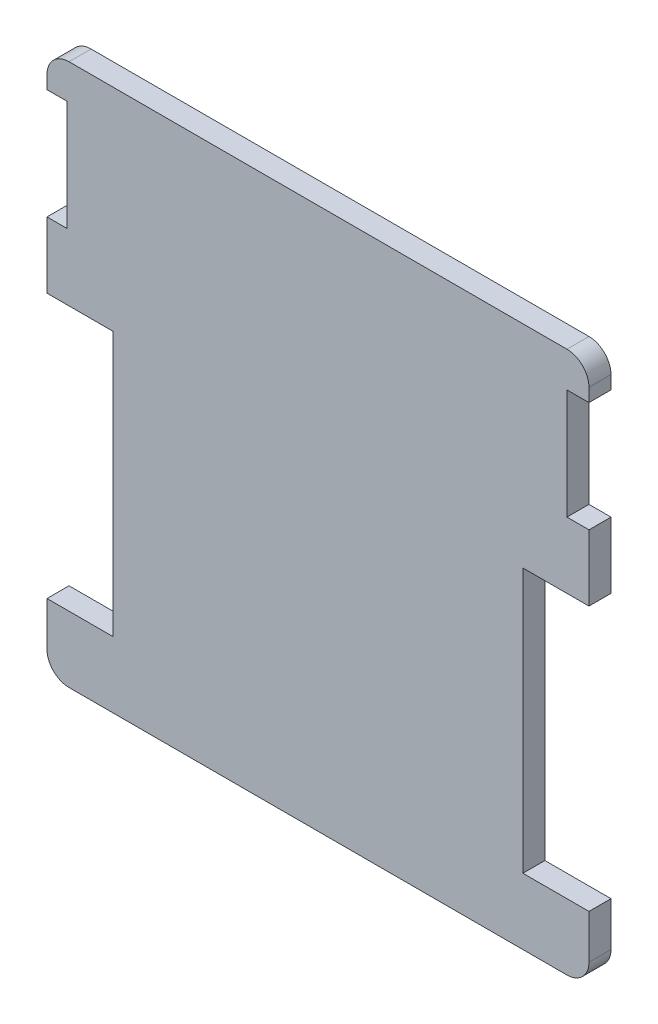
ISO-10303-21;
HEADER;
FILE_DESCRIPTION(('STEP AP214'),'2;1');
FILE_NAME('part.step','',(''),(''),'','','');
FILE_SCHEMA(('AUTOMOTIVE_DESIGN { 1 0 10303 214 1 1 1 1 }'));
ENDSEC;
DATA;
#1=APPLICATION_CONTEXT('core data for automotive mechanical design processes');
#2=APPLICATION_PROTOCOL_DEFINITION('international standard','automotive_design',2000,#1);
#3=PRODUCT_CONTEXT('',#1,'mechanical');
#4=PRODUCT('Part','Part','',(#3));
#5=PRODUCT_RELATED_PRODUCT_CATEGORY('part','',(#4));
#6=PRODUCT_DEFINITION_FORMATION('','',#4);
#7=PRODUCT_DEFINITION_CONTEXT('part definition',#1,'design');
#8=PRODUCT_DEFINITION('design','',#6,#7);
#9=PRODUCT_DEFINITION_SHAPE('','',#8);
#10=(LENGTH_UNIT() NAMED_UNIT(*) SI_UNIT(.MILLI.,.METRE.));
#11=(NAMED_UNIT(*) PLANE_ANGLE_UNIT() SI_UNIT($,.RADIAN.));
#12=(NAMED_UNIT(*) SI_UNIT($,.STERADIAN.) SOLID_ANGLE_UNIT());
#13=UNCERTAINTY_MEASURE_WITH_UNIT(LENGTH_MEASURE(1.E-05),#10,'distance_accuracy_value','');
#14=(GEOMETRIC_REPRESENTATION_CONTEXT(3) GLOBAL_UNCERTAINTY_ASSIGNED_CONTEXT((#13)) GLOBAL_UNIT_ASSIGNED_CONTEXT((#10,
#11,#12)) REPRESENTATION_CONTEXT('',''));
#15=CARTESIAN_POINT('',(0.,0.,0.));
#16=DIRECTION('',(0.,0.,1.));
#17=DIRECTION('',(1.,0.,0.));
#18=AXIS2_PLACEMENT_3D('',#15,#16,#17);
#19=CARTESIAN_POINT('',(70.189074271672,53.4855029585799,5.));
#20=DIRECTION('',(-1.,0.,0.));
#21=DIRECTION('',(0.,-1.,0.));
#22=AXIS2_PLACEMENT_3D('',#19,#20,#21);
#23=PLANE('',#22);
#24=DIRECTION('',(0.,1.,0.));
#25=VECTOR('',#24,1.);
#26=CARTESIAN_POINT('',(70.189074271672,53.4855029585799,0.));
#27=LINE('',#26,#25);
#28=CARTESIAN_POINT('',(70.189074271672,-59.5144970414201,0.));
#29=VERTEX_POINT('',#28);
#30=CARTESIAN_POINT('',(70.189074271672,-49.5144970414201,0.));
#31=VERTEX_POINT('',#30);
#32=EDGE_CURVE('E246',#29,#31,#27,.T.);
#33=ORIENTED_EDGE('',*,*,#32,.T.);
#34=DIRECTION('',(0.,0.,1.));
#35=VECTOR('',#34,1.);
#36=CARTESIAN_POINT('',(70.189074271672,-49.5144970414201,-20.));
#37=LINE('',#36,#35);
#38=CARTESIAN_POINT('',(70.189074271672,-49.5144970414201,5.));
#39=VERTEX_POINT('',#38);
#40=EDGE_CURVE('E301',#31,#39,#37,.T.);
#41=ORIENTED_EDGE('',*,*,#40,.T.);
#42=DIRECTION('',(0.,1.,0.));
#43=VECTOR('',#42,1.);
#44=CARTESIAN_POINT('',(70.189074271672,53.4855029585799,5.));
#45=LINE('',#44,#43);
#46=CARTESIAN_POINT('',(70.189074271672,-59.5144970414201,5.));
#47=VERTEX_POINT('',#46);
#48=EDGE_CURVE('E217',#47,#39,#45,.T.);
#49=ORIENTED_EDGE('',*,*,#48,.F.);
#50=DIRECTION('',(0.,0.,-1.));
#51=VECTOR('',#50,1.);
#52=CARTESIAN_POINT('',(70.189074271672,-59.5144970414201,5.));
#53=LINE('',#52,#51);
#54=EDGE_CURVE('E253',#47,#29,#53,.T.);
#55=ORIENTED_EDGE('',*,*,#54,.T.);
#56=EDGE_LOOP('',(#33,#41,#49,#55));
#57=FACE_BOUND('',#56,.T.);
#58=ADVANCED_FACE('F33',(#57),#23,.F.);
#59=CARTESIAN_POINT('',(-52.810925728328,53.4855029585799,5.));
#60=DIRECTION('',(1.,0.,0.));
#61=DIRECTION('',(0.,1.,0.));
#62=AXIS2_PLACEMENT_3D('',#59,#60,#61);
#63=PLANE('',#62);
#64=DIRECTION('',(0.,-1.,0.));
#65=VECTOR('',#64,1.);
#66=CARTESIAN_POINT('',(-52.810925728328,53.4855029585799,0.));
#67=LINE('',#66,#65);
#68=CARTESIAN_POINT('',(-52.810925728328,25.4855029585799,0.));
#69=VERTEX_POINT('',#68);
#70=CARTESIAN_POINT('',(-52.810925728328,10.4855029585799,0.));
#71=VERTEX_POINT('',#70);
#72=EDGE_CURVE('E239',#69,#71,#67,.T.);
#73=ORIENTED_EDGE('',*,*,#72,.T.);
#74=DIRECTION('',(0.,0.,1.));
#75=VECTOR('',#74,1.);
#76=CARTESIAN_POINT('',(-52.810925728328,10.4855029585799,-5.));
#77=LINE('',#76,#75);
#78=CARTESIAN_POINT('',(-52.810925728328,10.4855029585799,5.));
#79=VERTEX_POINT('',#78);
#80=EDGE_CURVE('E316',#71,#79,#77,.T.);
#81=ORIENTED_EDGE('',*,*,#80,.T.);
#82=DIRECTION('',(0.,-1.,0.));
#83=VECTOR('',#82,1.);
#84=CARTESIAN_POINT('',(-52.810925728328,53.4855029585799,5.));
#85=LINE('',#84,#83);
#86=CARTESIAN_POINT('',(-52.810925728328,25.4855029585799,5.));
#87=VERTEX_POINT('',#86);
#88=EDGE_CURVE('E374',#87,#79,#85,.T.);
#89=ORIENTED_EDGE('',*,*,#88,.F.);
#90=DIRECTION('',(0.,0.,1.));
#91=VECTOR('',#90,1.);
#92=CARTESIAN_POINT('',(-52.810925728328,25.4855029585799,0.));
#93=LINE('',#92,#91);
#94=EDGE_CURVE('E349',#69,#87,#93,.T.);
#95=ORIENTED_EDGE('',*,*,#94,.F.);
#96=EDGE_LOOP('',(#73,#81,#89,#95));
#97=FACE_BOUND('',#96,.T.);
#98=ADVANCED_FACE('F398',(#97),#63,.F.);
#99=CARTESIAN_POINT('',(70.189074271672,10.4855029585799,5.));
#100=VERTEX_POINT('',#99);
#101=CARTESIAN_POINT('',(70.189074271672,25.4855029585799,5.));
#102=VERTEX_POINT('',#101);
#103=EDGE_CURVE('E208',#100,#102,#45,.T.);
#104=ORIENTED_EDGE('',*,*,#103,.F.);
#105=DIRECTION('',(0.,0.,1.));
#106=VECTOR('',#105,1.);
#107=CARTESIAN_POINT('',(70.189074271672,10.4855029585799,-20.));
#108=LINE('',#107,#106);
#109=CARTESIAN_POINT('',(70.189074271672,10.4855029585799,0.));
#110=VERTEX_POINT('',#109);
#111=EDGE_CURVE('E192',#110,#100,#108,.T.);
#112=ORIENTED_EDGE('',*,*,#111,.F.);
#113=CARTESIAN_POINT('',(70.189074271672,25.4855029585799,0.));
#114=VERTEX_POINT('',#113);
#115=EDGE_CURVE('E250',#110,#114,#27,.T.);
#116=ORIENTED_EDGE('',*,*,#115,.T.);
#117=DIRECTION('',(0.,0.,1.));
#118=VECTOR('',#117,1.);
#119=CARTESIAN_POINT('',(70.189074271672,25.4855029585799,-5.));
#120=LINE('',#119,#118);
#121=EDGE_CURVE('E216',#114,#102,#120,.T.);
#122=ORIENTED_EDGE('',*,*,#121,.T.);
#123=EDGE_LOOP('',(#104,#112,#116,#122));
#124=FACE_BOUND('',#123,.T.);
#125=ADVANCED_FACE('F214',(#124),#23,.F.);
#126=CARTESIAN_POINT('',(-52.810925728328,53.4855029585799,0.));
#127=VERTEX_POINT('',#126);
#128=CARTESIAN_POINT('',(-52.810925728328,50.4855029585799,0.));
#129=VERTEX_POINT('',#128);
#130=EDGE_CURVE('E235',#127,#129,#67,.T.);
#131=ORIENTED_EDGE('',*,*,#130,.T.);
#132=DIRECTION('',(0.,0.,1.));
#133=VECTOR('',#132,1.);
#134=CARTESIAN_POINT('',(-52.810925728328,50.4855029585799,0.));
#135=LINE('',#134,#133);
#136=CARTESIAN_POINT('',(-52.810925728328,50.4855029585799,5.));
#137=VERTEX_POINT('',#136);
#138=EDGE_CURVE('E230',#129,#137,#135,.T.);
#139=ORIENTED_EDGE('',*,*,#138,.T.);
#140=CARTESIAN_POINT('',(-52.810925728328,53.4855029585799,5.));
#141=VERTEX_POINT('',#140);
#142=EDGE_CURVE('E370',#141,#137,#85,.T.);
#143=ORIENTED_EDGE('',*,*,#142,.F.);
#144=DIRECTION('',(0.,0.,-1.));
#145=VECTOR('',#144,1.);
#146=CARTESIAN_POINT('',(-52.810925728328,53.4855029585799,5.));
#147=LINE('',#146,#145);
#148=EDGE_CURVE('E265',#141,#127,#147,.T.);
#149=ORIENTED_EDGE('',*,*,#148,.T.);
#150=EDGE_LOOP('',(#131,#139,#143,#149));
#151=FACE_BOUND('',#150,.T.);
#152=ADVANCED_FACE('F406',(#151),#63,.F.);
#153=CARTESIAN_POINT('',(65.189074271672,53.4855029585799,5.));
#154=DIRECTION('',(0.,0.,-1.));
#155=DIRECTION('',(-1.,0.,0.));
#156=AXIS2_PLACEMENT_3D('',#153,#154,#155);
#157=CYLINDRICAL_SURFACE('',#156,4.99999999999999);
#158=CARTESIAN_POINT('',(65.189074271672,53.4855029585799,0.));
#159=DIRECTION('',(0.,0.,1.));
#160=DIRECTION('',(1.,0.,0.));
#161=AXIS2_PLACEMENT_3D('',#158,#159,#160);
#162=CIRCLE('',#161,4.99999999999999);
#163=CARTESIAN_POINT('',(70.189074271672,53.4855029585799,0.));
#164=VERTEX_POINT('',#163);
#165=CARTESIAN_POINT('',(65.189074271672,58.4855029585799,0.));
#166=VERTEX_POINT('',#165);
#167=EDGE_CURVE('E226',#164,#166,#162,.T.);
#168=ORIENTED_EDGE('',*,*,#167,.T.);
#169=DIRECTION('',(0.,0.,-1.));
#170=VECTOR('',#169,1.);
#171=CARTESIAN_POINT('',(65.189074271672,58.4855029585799,5.));
#172=LINE('',#171,#170);
#173=CARTESIAN_POINT('',(65.189074271672,58.4855029585799,5.));
#174=VERTEX_POINT('',#173);
#175=EDGE_CURVE('E271',#174,#166,#172,.T.);
#176=ORIENTED_EDGE('',*,*,#175,.F.);
#177=CARTESIAN_POINT('',(65.189074271672,53.4855029585799,5.));
#178=DIRECTION('',(0.,0.,1.));
#179=DIRECTION('',(1.,0.,0.));
#180=AXIS2_PLACEMENT_3D('',#177,#178,#179);
#181=CIRCLE('',#180,4.99999999999999);
#182=CARTESIAN_POINT('',(70.189074271672,53.4855029585799,5.));
#183=VERTEX_POINT('',#182);
#184=EDGE_CURVE('E249',#183,#174,#181,.T.);
#185=ORIENTED_EDGE('',*,*,#184,.F.);
#186=DIRECTION('',(0.,0.,-1.));
#187=VECTOR('',#186,1.);
#188=CARTESIAN_POINT('',(70.189074271672,53.4855029585799,5.));
#189=LINE('',#188,#187);
#190=EDGE_CURVE('E221',#183,#164,#189,.T.);
#191=ORIENTED_EDGE('',*,*,#190,.T.);
#192=EDGE_LOOP('',(#168,#176,#185,#191));
#193=FACE_BOUND('',#192,.T.);
#194=ADVANCED_FACE('F35',(#193),#157,.T.);
#195=CARTESIAN_POINT('',(-47.810925728328,58.4855029585799,5.));
#196=DIRECTION('',(0.,-1.,0.));
#197=DIRECTION('',(0.,0.,-1.));
#198=AXIS2_PLACEMENT_3D('',#195,#196,#197);
#199=PLANE('',#198);
#200=DIRECTION('',(-1.,0.,0.));
#201=VECTOR('',#200,1.);
#202=CARTESIAN_POINT('',(-47.810925728328,58.4855029585799,0.));
#203=LINE('',#202,#201);
#204=CARTESIAN_POINT('',(-47.810925728328,58.4855029585799,0.));
#205=VERTEX_POINT('',#204);
#206=EDGE_CURVE('E229',#166,#205,#203,.T.);
#207=ORIENTED_EDGE('',*,*,#206,.T.);
#208=DIRECTION('',(0.,0.,-1.));
#209=VECTOR('',#208,1.);
#210=CARTESIAN_POINT('',(-47.810925728328,58.4855029585799,5.));
#211=LINE('',#210,#209);
#212=CARTESIAN_POINT('',(-47.810925728328,58.4855029585799,5.));
#213=VERTEX_POINT('',#212);
#214=EDGE_CURVE('E268',#213,#205,#211,.T.);
#215=ORIENTED_EDGE('',*,*,#214,.F.);
#216=DIRECTION('',(-1.,0.,0.));
#217=VECTOR('',#216,1.);
#218=CARTESIAN_POINT('',(-47.810925728328,58.4855029585799,5.));
#219=LINE('',#218,#217);
#220=EDGE_CURVE('E365',#174,#213,#219,.T.);
#221=ORIENTED_EDGE('',*,*,#220,.F.);
#222=ORIENTED_EDGE('',*,*,#175,.T.);
#223=EDGE_LOOP('',(#207,#215,#221,#222));
#224=FACE_BOUND('',#223,.T.);
#225=ADVANCED_FACE('F597',(#224),#199,.F.);
#226=CARTESIAN_POINT('',(-47.810925728328,53.4855029585799,5.));
#227=DIRECTION('',(0.,0.,-1.));
#228=DIRECTION('',(-1.,0.,0.));
#229=AXIS2_PLACEMENT_3D('',#226,#227,#228);
#230=CYLINDRICAL_SURFACE('',#229,5.);
#231=CARTESIAN_POINT('',(-47.810925728328,53.4855029585799,0.));
#232=DIRECTION('',(0.,0.,1.));
#233=DIRECTION('',(-1.,0.,0.));
#234=AXIS2_PLACEMENT_3D('',#231,#232,#233);
#235=CIRCLE('',#234,5.);
#236=EDGE_CURVE('E232',#205,#127,#235,.T.);
#237=ORIENTED_EDGE('',*,*,#236,.T.);
#238=ORIENTED_EDGE('',*,*,#148,.F.);
#239=CARTESIAN_POINT('',(-47.810925728328,53.4855029585799,5.));
#240=DIRECTION('',(0.,0.,1.));
#241=DIRECTION('',(-1.,0.,0.));
#242=AXIS2_PLACEMENT_3D('',#239,#240,#241);
#243=CIRCLE('',#242,5.);
#244=EDGE_CURVE('E367',#213,#141,#243,.T.);
#245=ORIENTED_EDGE('',*,*,#244,.F.);
#246=ORIENTED_EDGE('',*,*,#214,.T.);
#247=EDGE_LOOP('',(#237,#238,#245,#246));
#248=FACE_BOUND('',#247,.T.);
#249=ADVANCED_FACE('F510',(#248),#230,.T.);
#250=CARTESIAN_POINT('',(-52.810925728328,-49.5144970414201,5.));
#251=VERTEX_POINT('',#250);
#252=CARTESIAN_POINT('',(-52.810925728328,-59.5144970414201,5.));
#253=VERTEX_POINT('',#252);
#254=EDGE_CURVE('E369',#251,#253,#85,.T.);
#255=ORIENTED_EDGE('',*,*,#254,.F.);
#256=DIRECTION('',(0.,0.,1.));
#257=VECTOR('',#256,1.);
#258=CARTESIAN_POINT('',(-52.810925728328,-49.5144970414201,-5.));
#259=LINE('',#258,#257);
#260=CARTESIAN_POINT('',(-52.810925728328,-49.5144970414201,0.));
#261=VERTEX_POINT('',#260);
#262=EDGE_CURVE('E315',#261,#251,#259,.T.);
#263=ORIENTED_EDGE('',*,*,#262,.F.);
#264=CARTESIAN_POINT('',(-52.810925728328,-59.5144970414201,0.));
#265=VERTEX_POINT('',#264);
#266=EDGE_CURVE('E234',#261,#265,#67,.T.);
#267=ORIENTED_EDGE('',*,*,#266,.T.);
#268=DIRECTION('',(0.,0.,-1.));
#269=VECTOR('',#268,1.);
#270=CARTESIAN_POINT('',(-52.810925728328,-59.5144970414201,5.));
#271=LINE('',#270,#269);
#272=EDGE_CURVE('E262',#253,#265,#271,.T.);
#273=ORIENTED_EDGE('',*,*,#272,.F.);
#274=EDGE_LOOP('',(#255,#263,#267,#273));
#275=FACE_BOUND('',#274,.T.);
#276=ADVANCED_FACE('F407',(#275),#63,.F.);
#277=CARTESIAN_POINT('',(-47.810925728328,-59.5144970414201,5.));
#278=DIRECTION('',(0.,0.,-1.));
#279=DIRECTION('',(-1.,0.,0.));
#280=AXIS2_PLACEMENT_3D('',#277,#278,#279);
#281=CYLINDRICAL_SURFACE('',#280,5.);
#282=CARTESIAN_POINT('',(-47.810925728328,-59.5144970414201,0.));
#283=DIRECTION('',(0.,0.,1.));
#284=DIRECTION('',(1.,0.,0.));
#285=AXIS2_PLACEMENT_3D('',#282,#283,#284);
#286=CIRCLE('',#285,5.);
#287=CARTESIAN_POINT('',(-47.810925728328,-64.5144970414201,0.));
#288=VERTEX_POINT('',#287);
#289=EDGE_CURVE('E238',#265,#288,#286,.T.);
#290=ORIENTED_EDGE('',*,*,#289,.T.);
#291=DIRECTION('',(0.,0.,-1.));
#292=VECTOR('',#291,1.);
#293=CARTESIAN_POINT('',(-47.810925728328,-64.5144970414201,5.));
#294=LINE('',#293,#292);
#295=CARTESIAN_POINT('',(-47.810925728328,-64.5144970414201,5.));
#296=VERTEX_POINT('',#295);
#297=EDGE_CURVE('E259',#296,#288,#294,.T.);
#298=ORIENTED_EDGE('',*,*,#297,.F.);
#299=CARTESIAN_POINT('',(-47.810925728328,-59.5144970414201,5.));
#300=DIRECTION('',(0.,0.,1.));
#301=DIRECTION('',(1.,0.,0.));
#302=AXIS2_PLACEMENT_3D('',#299,#300,#301);
#303=CIRCLE('',#302,5.);
#304=EDGE_CURVE('E373',#253,#296,#303,.T.);
#305=ORIENTED_EDGE('',*,*,#304,.F.);
#306=ORIENTED_EDGE('',*,*,#272,.T.);
#307=EDGE_LOOP('',(#290,#298,#305,#306));
#308=FACE_BOUND('',#307,.T.);
#309=ADVANCED_FACE('F509',(#308),#281,.T.);
#310=CARTESIAN_POINT('',(-47.810925728328,-64.5144970414201,5.));
#311=DIRECTION('',(0.,1.,0.));
#312=DIRECTION('',(0.,0.,1.));
#313=AXIS2_PLACEMENT_3D('',#310,#311,#312);
#314=PLANE('',#313);
#315=DIRECTION('',(1.,0.,0.));
#316=VECTOR('',#315,1.);
#317=CARTESIAN_POINT('',(-47.810925728328,-64.5144970414201,0.));
#318=LINE('',#317,#316);
#319=CARTESIAN_POINT('',(65.189074271672,-64.5144970414201,0.));
#320=VERTEX_POINT('',#319);
#321=EDGE_CURVE('E241',#288,#320,#318,.T.);
#322=ORIENTED_EDGE('',*,*,#321,.T.);
#323=DIRECTION('',(0.,0.,-1.));
#324=VECTOR('',#323,1.);
#325=CARTESIAN_POINT('',(65.189074271672,-64.5144970414201,5.));
#326=LINE('',#325,#324);
#327=CARTESIAN_POINT('',(65.189074271672,-64.5144970414201,5.));
#328=VERTEX_POINT('',#327);
#329=EDGE_CURVE('E256',#328,#320,#326,.T.);
#330=ORIENTED_EDGE('',*,*,#329,.F.);
#331=DIRECTION('',(1.,0.,0.));
#332=VECTOR('',#331,1.);
#333=CARTESIAN_POINT('',(-47.810925728328,-64.5144970414201,5.));
#334=LINE('',#333,#332);
#335=EDGE_CURVE('E375',#296,#328,#334,.T.);
#336=ORIENTED_EDGE('',*,*,#335,.F.);
#337=ORIENTED_EDGE('',*,*,#297,.T.);
#338=EDGE_LOOP('',(#322,#330,#336,#337));
#339=FACE_BOUND('',#338,.T.);
#340=ADVANCED_FACE('F418',(#339),#314,.F.);
#341=CARTESIAN_POINT('',(65.189074271672,-59.5144970414201,5.));
#342=DIRECTION('',(0.,0.,-1.));
#343=DIRECTION('',(-1.,0.,0.));
#344=AXIS2_PLACEMENT_3D('',#341,#342,#343);
#345=CYLINDRICAL_SURFACE('',#344,5.00000000000001);
#346=CARTESIAN_POINT('',(65.189074271672,-59.5144970414201,0.));
#347=DIRECTION('',(0.,0.,1.));
#348=DIRECTION('',(-1.,0.,0.));
#349=AXIS2_PLACEMENT_3D('',#346,#347,#348);
#350=CIRCLE('',#349,5.00000000000001);
#351=EDGE_CURVE('E243',#320,#29,#350,.T.);
#352=ORIENTED_EDGE('',*,*,#351,.T.);
#353=ORIENTED_EDGE('',*,*,#54,.F.);
#354=CARTESIAN_POINT('',(65.189074271672,-59.5144970414201,5.));
#355=DIRECTION('',(0.,0.,1.));
#356=DIRECTION('',(-1.,0.,0.));
#357=AXIS2_PLACEMENT_3D('',#354,#355,#356);
#358=CIRCLE('',#357,5.00000000000001);
#359=EDGE_CURVE('E222',#328,#47,#358,.T.);
#360=ORIENTED_EDGE('',*,*,#359,.F.);
#361=ORIENTED_EDGE('',*,*,#329,.T.);
#362=EDGE_LOOP('',(#352,#353,#360,#361));
#363=FACE_BOUND('',#362,.T.);
#364=ADVANCED_FACE('F382',(#363),#345,.T.);
#365=CARTESIAN_POINT('',(70.189074271672,50.4855029585799,5.));
#366=VERTEX_POINT('',#365);
#367=EDGE_CURVE('E218',#366,#183,#45,.T.);
#368=ORIENTED_EDGE('',*,*,#367,.F.);
#369=DIRECTION('',(0.,0.,1.));
#370=VECTOR('',#369,1.);
#371=CARTESIAN_POINT('',(70.189074271672,50.4855029585799,-5.));
#372=LINE('',#371,#370);
#373=CARTESIAN_POINT('',(70.189074271672,50.4855029585799,0.));
#374=VERTEX_POINT('',#373);
#375=EDGE_CURVE('E331',#374,#366,#372,.T.);
#376=ORIENTED_EDGE('',*,*,#375,.F.);
#377=EDGE_CURVE('E245',#374,#164,#27,.T.);
#378=ORIENTED_EDGE('',*,*,#377,.T.);
#379=ORIENTED_EDGE('',*,*,#190,.F.);
#380=EDGE_LOOP('',(#368,#376,#378,#379));
#381=FACE_BOUND('',#380,.T.);
#382=ADVANCED_FACE('F400',(#381),#23,.F.);
#383=CARTESIAN_POINT('',(65.189074271672,53.4855029585799,5.));
#384=DIRECTION('',(0.,0.,1.));
#385=DIRECTION('',(1.,0.,0.));
#386=AXIS2_PLACEMENT_3D('',#383,#384,#385);
#387=PLANE('',#386);
#388=DIRECTION('',(1.,0.,0.));
#389=VECTOR('',#388,1.);
#390=CARTESIAN_POINT('',(70.189074271672,-49.5144970414201,5.));
#391=LINE('',#390,#389);
#392=CARTESIAN_POINT('',(55.189074271672,-49.5144970414201,5.));
#393=VERTEX_POINT('',#392);
#394=EDGE_CURVE('E202',#393,#39,#391,.T.);
#395=ORIENTED_EDGE('',*,*,#394,.F.);
#396=DIRECTION('',(0.,-1.,0.));
#397=VECTOR('',#396,1.);
#398=CARTESIAN_POINT('',(55.189074271672,-49.5144970414201,5.));
#399=LINE('',#398,#397);
#400=CARTESIAN_POINT('',(55.189074271672,10.4855029585799,5.));
#401=VERTEX_POINT('',#400);
#402=EDGE_CURVE('E211',#401,#393,#399,.T.);
#403=ORIENTED_EDGE('',*,*,#402,.F.);
#404=DIRECTION('',(-1.,0.,0.));
#405=VECTOR('',#404,1.);
#406=CARTESIAN_POINT('',(70.189074271672,10.4855029585799,5.));
#407=LINE('',#406,#405);
#408=EDGE_CURVE('E195',#100,#401,#407,.T.);
#409=ORIENTED_EDGE('',*,*,#408,.F.);
#410=ORIENTED_EDGE('',*,*,#103,.T.);
#411=DIRECTION('',(1.,0.,0.));
#412=VECTOR('',#411,1.);
#413=CARTESIAN_POINT('',(70.189074271672,25.4855029585799,5.));
#414=LINE('',#413,#412);
#415=CARTESIAN_POINT('',(65.189074271672,25.4855029585799,5.));
#416=VERTEX_POINT('',#415);
#417=EDGE_CURVE('E329',#416,#102,#414,.T.);
#418=ORIENTED_EDGE('',*,*,#417,.F.);
#419=DIRECTION('',(0.,-1.,0.));
#420=VECTOR('',#419,1.);
#421=CARTESIAN_POINT('',(65.189074271672,50.4855029585799,5.));
#422=LINE('',#421,#420);
#423=CARTESIAN_POINT('',(65.189074271672,50.4855029585799,5.));
#424=VERTEX_POINT('',#423);
#425=EDGE_CURVE('E326',#424,#416,#422,.T.);
#426=ORIENTED_EDGE('',*,*,#425,.F.);
#427=DIRECTION('',(-1.,0.,0.));
#428=VECTOR('',#427,1.);
#429=CARTESIAN_POINT('',(70.189074271672,50.4855029585799,5.));
#430=LINE('',#429,#428);
#431=EDGE_CURVE('E319',#366,#424,#430,.T.);
#432=ORIENTED_EDGE('',*,*,#431,.F.);
#433=ORIENTED_EDGE('',*,*,#367,.T.);
#434=ORIENTED_EDGE('',*,*,#184,.T.);
#435=ORIENTED_EDGE('',*,*,#220,.T.);
#436=ORIENTED_EDGE('',*,*,#244,.T.);
#437=ORIENTED_EDGE('',*,*,#142,.T.);
#438=DIRECTION('',(-1.,0.,0.));
#439=VECTOR('',#438,1.);
#440=CARTESIAN_POINT('',(-52.810925728328,50.4855029585799,5.));
#441=LINE('',#440,#439);
#442=CARTESIAN_POINT('',(-48.3154315939984,50.4855029585799,5.));
#443=VERTEX_POINT('',#442);
#444=EDGE_CURVE('E343',#443,#137,#441,.T.);
#445=ORIENTED_EDGE('',*,*,#444,.F.);
#446=DIRECTION('',(0.,1.,0.));
#447=VECTOR('',#446,1.);
#448=CARTESIAN_POINT('',(-48.3154315939984,50.4855029585799,5.));
#449=LINE('',#448,#447);
#450=CARTESIAN_POINT('',(-48.3154315939984,25.4855029585799,5.));
#451=VERTEX_POINT('',#450);
#452=EDGE_CURVE('E352',#451,#443,#449,.T.);
#453=ORIENTED_EDGE('',*,*,#452,.F.);
#454=DIRECTION('',(1.,0.,0.));
#455=VECTOR('',#454,1.);
#456=CARTESIAN_POINT('',(-52.810925728328,25.4855029585799,5.));
#457=LINE('',#456,#455);
#458=EDGE_CURVE('E333',#87,#451,#457,.T.);
#459=ORIENTED_EDGE('',*,*,#458,.F.);
#460=ORIENTED_EDGE('',*,*,#88,.T.);
#461=DIRECTION('',(-1.,0.,0.));
#462=VECTOR('',#461,1.);
#463=CARTESIAN_POINT('',(-52.810925728328,10.4855029585799,5.));
#464=LINE('',#463,#462);
#465=CARTESIAN_POINT('',(-37.810925728328,10.4855029585799,5.));
#466=VERTEX_POINT('',#465);
#467=EDGE_CURVE('E313',#466,#79,#464,.T.);
#468=ORIENTED_EDGE('',*,*,#467,.F.);
#469=DIRECTION('',(0.,1.,0.));
#470=VECTOR('',#469,1.);
#471=CARTESIAN_POINT('',(-37.810925728328,-49.5144970414201,5.));
#472=LINE('',#471,#470);
#473=CARTESIAN_POINT('',(-37.810925728328,-49.5144970414201,5.));
#474=VERTEX_POINT('',#473);
#475=EDGE_CURVE('E310',#474,#466,#472,.T.);
#476=ORIENTED_EDGE('',*,*,#475,.F.);
#477=DIRECTION('',(1.,0.,0.));
#478=VECTOR('',#477,1.);
#479=CARTESIAN_POINT('',(-52.810925728328,-49.5144970414201,5.));
#480=LINE('',#479,#478);
#481=EDGE_CURVE('E304',#251,#474,#480,.T.);
#482=ORIENTED_EDGE('',*,*,#481,.F.);
#483=ORIENTED_EDGE('',*,*,#254,.T.);
#484=ORIENTED_EDGE('',*,*,#304,.T.);
#485=ORIENTED_EDGE('',*,*,#335,.T.);
#486=ORIENTED_EDGE('',*,*,#359,.T.);
#487=ORIENTED_EDGE('',*,*,#48,.T.);
#488=EDGE_LOOP('',(#395,#403,#409,#410,#418,#426,#432,#433,#434,#435,#436,#437,#445,#453,#459,
#460,#468,#476,#482,#483,#484,#485,#486,#487));
#489=FACE_BOUND('',#488,.T.);
#490=ADVANCED_FACE('F206',(#489),#387,.T.);
#491=CARTESIAN_POINT('',(65.189074271672,53.4855029585799,0.));
#492=DIRECTION('',(0.,0.,1.));
#493=DIRECTION('',(1.,0.,0.));
#494=AXIS2_PLACEMENT_3D('',#491,#492,#493);
#495=PLANE('',#494);
#496=DIRECTION('',(0.,-1.,0.));
#497=VECTOR('',#496,1.);
#498=CARTESIAN_POINT('',(55.189074271672,53.4855029585799,0.));
#499=LINE('',#498,#497);
#500=CARTESIAN_POINT('',(55.189074271672,10.4855029585799,0.));
#501=VERTEX_POINT('',#500);
#502=CARTESIAN_POINT('',(55.189074271672,-49.5144970414201,0.));
#503=VERTEX_POINT('',#502);
#504=EDGE_CURVE('E41',#501,#503,#499,.T.);
#505=ORIENTED_EDGE('',*,*,#504,.T.);
#506=DIRECTION('',(1.,0.,0.));
#507=VECTOR('',#506,1.);
#508=CARTESIAN_POINT('',(65.189074271672,-49.5144970414201,0.));
#509=LINE('',#508,#507);
#510=EDGE_CURVE('E11',#503,#31,#509,.T.);
#511=ORIENTED_EDGE('',*,*,#510,.T.);
#512=ORIENTED_EDGE('',*,*,#32,.F.);
#513=ORIENTED_EDGE('',*,*,#351,.F.);
#514=ORIENTED_EDGE('',*,*,#321,.F.);
#515=ORIENTED_EDGE('',*,*,#289,.F.);
#516=ORIENTED_EDGE('',*,*,#266,.F.);
#517=DIRECTION('',(1.,0.,0.));
#518=VECTOR('',#517,1.);
#519=CARTESIAN_POINT('',(65.1890742716719,-49.5144970414202,0.));
#520=LINE('',#519,#518);
#521=CARTESIAN_POINT('',(-37.810925728328,-49.5144970414201,0.));
#522=VERTEX_POINT('',#521);
#523=EDGE_CURVE('E283',#261,#522,#520,.T.);
#524=ORIENTED_EDGE('',*,*,#523,.T.);
#525=DIRECTION('',(0.,1.,0.));
#526=VECTOR('',#525,1.);
#527=CARTESIAN_POINT('',(-37.810925728328,53.4855029585799,0.));
#528=LINE('',#527,#526);
#529=CARTESIAN_POINT('',(-37.810925728328,10.4855029585799,0.));
#530=VERTEX_POINT('',#529);
#531=EDGE_CURVE('E286',#522,#530,#528,.T.);
#532=ORIENTED_EDGE('',*,*,#531,.T.);
#533=DIRECTION('',(-1.,0.,0.));
#534=VECTOR('',#533,1.);
#535=CARTESIAN_POINT('',(65.189074271672,10.4855029585799,0.));
#536=LINE('',#535,#534);
#537=EDGE_CURVE('E289',#530,#71,#536,.T.);
#538=ORIENTED_EDGE('',*,*,#537,.T.);
#539=ORIENTED_EDGE('',*,*,#72,.F.);
#540=DIRECTION('',(1.,0.,0.));
#541=VECTOR('',#540,1.);
#542=CARTESIAN_POINT('',(-52.810925728328,25.4855029585799,0.));
#543=LINE('',#542,#541);
#544=CARTESIAN_POINT('',(-48.3154315939984,25.4855029585799,0.));
#545=VERTEX_POINT('',#544);
#546=EDGE_CURVE('E339',#69,#545,#543,.T.);
#547=ORIENTED_EDGE('',*,*,#546,.T.);
#548=DIRECTION('',(0.,1.,0.));
#549=VECTOR('',#548,1.);
#550=CARTESIAN_POINT('',(-48.3154315939984,50.4855029585799,0.));
#551=LINE('',#550,#549);
#552=CARTESIAN_POINT('',(-48.3154315939984,50.4855029585799,0.));
#553=VERTEX_POINT('',#552);
#554=EDGE_CURVE('E342',#545,#553,#551,.T.);
#555=ORIENTED_EDGE('',*,*,#554,.T.);
#556=DIRECTION('',(-1.,0.,0.));
#557=VECTOR('',#556,1.);
#558=CARTESIAN_POINT('',(-52.810925728328,50.4855029585799,0.));
#559=LINE('',#558,#557);
#560=EDGE_CURVE('E346',#553,#129,#559,.T.);
#561=ORIENTED_EDGE('',*,*,#560,.T.);
#562=ORIENTED_EDGE('',*,*,#130,.F.);
#563=ORIENTED_EDGE('',*,*,#236,.F.);
#564=ORIENTED_EDGE('',*,*,#206,.F.);
#565=ORIENTED_EDGE('',*,*,#167,.F.);
#566=ORIENTED_EDGE('',*,*,#377,.F.);
#567=DIRECTION('',(-1.,0.,0.));
#568=VECTOR('',#567,1.);
#569=CARTESIAN_POINT('',(65.189074271672,50.4855029585799,0.));
#570=LINE('',#569,#568);
#571=CARTESIAN_POINT('',(65.189074271672,50.4855029585799,0.));
#572=VERTEX_POINT('',#571);
#573=EDGE_CURVE('E274',#374,#572,#570,.T.);
#574=ORIENTED_EDGE('',*,*,#573,.T.);
#575=DIRECTION('',(0.,-1.,0.));
#576=VECTOR('',#575,1.);
#577=CARTESIAN_POINT('',(65.189074271672,53.4855029585799,0.));
#578=LINE('',#577,#576);
#579=CARTESIAN_POINT('',(65.189074271672,25.4855029585799,0.));
#580=VERTEX_POINT('',#579);
#581=EDGE_CURVE('E277',#572,#580,#578,.T.);
#582=ORIENTED_EDGE('',*,*,#581,.T.);
#583=DIRECTION('',(1.,0.,0.));
#584=VECTOR('',#583,1.);
#585=CARTESIAN_POINT('',(65.189074271672,25.4855029585799,0.));
#586=LINE('',#585,#584);
#587=EDGE_CURVE('E280',#580,#114,#586,.T.);
#588=ORIENTED_EDGE('',*,*,#587,.T.);
#589=ORIENTED_EDGE('',*,*,#115,.F.);
#590=DIRECTION('',(-1.,0.,0.));
#591=VECTOR('',#590,1.);
#592=CARTESIAN_POINT('',(65.189074271672,10.4855029585799,0.));
#593=LINE('',#592,#591);
#594=EDGE_CURVE('E198',#110,#501,#593,.T.);
#595=ORIENTED_EDGE('',*,*,#594,.T.);
#596=EDGE_LOOP('',(#505,#511,#512,#513,#514,#515,#516,#524,#532,#538,#539,#547,#555,#561,#562,
#563,#564,#565,#566,#574,#582,#588,#589,#595));
#597=FACE_BOUND('',#596,.T.);
#598=ADVANCED_FACE('F294',(#597),#495,.F.);
#599=CARTESIAN_POINT('',(-52.810925728328,50.4855029585799,0.));
#600=DIRECTION('',(0.,1.,0.));
#601=DIRECTION('',(0.,0.,1.));
#602=AXIS2_PLACEMENT_3D('',#599,#600,#601);
#603=PLANE('',#602);
#604=ORIENTED_EDGE('',*,*,#444,.T.);
#605=ORIENTED_EDGE('',*,*,#138,.F.);
#606=ORIENTED_EDGE('',*,*,#560,.F.);
#607=DIRECTION('',(0.,0.,1.));
#608=VECTOR('',#607,1.);
#609=CARTESIAN_POINT('',(-48.3154315939984,50.4855029585799,0.));
#610=LINE('',#609,#608);
#611=EDGE_CURVE('E358',#553,#443,#610,.T.);
#612=ORIENTED_EDGE('',*,*,#611,.T.);
#613=EDGE_LOOP('',(#604,#605,#606,#612));
#614=FACE_BOUND('',#613,.T.);
#615=ADVANCED_FACE('F447',(#614),#603,.F.);
#616=CARTESIAN_POINT('',(-48.3154315939984,50.4855029585799,0.));
#617=DIRECTION('',(1.,0.,0.));
#618=DIRECTION('',(0.,0.,-1.));
#619=AXIS2_PLACEMENT_3D('',#616,#617,#618);
#620=PLANE('',#619);
#621=ORIENTED_EDGE('',*,*,#452,.T.);
#622=ORIENTED_EDGE('',*,*,#611,.F.);
#623=ORIENTED_EDGE('',*,*,#554,.F.);
#624=DIRECTION('',(0.,0.,1.));
#625=VECTOR('',#624,1.);
#626=CARTESIAN_POINT('',(-48.3154315939984,25.4855029585799,0.));
#627=LINE('',#626,#625);
#628=EDGE_CURVE('E360',#545,#451,#627,.T.);
#629=ORIENTED_EDGE('',*,*,#628,.T.);
#630=EDGE_LOOP('',(#621,#622,#623,#629));
#631=FACE_BOUND('',#630,.T.);
#632=ADVANCED_FACE('F450',(#631),#620,.F.);
#633=CARTESIAN_POINT('',(-52.810925728328,25.4855029585799,0.));
#634=DIRECTION('',(0.,-1.,0.));
#635=DIRECTION('',(0.,0.,-1.));
#636=AXIS2_PLACEMENT_3D('',#633,#634,#635);
#637=PLANE('',#636);
#638=ORIENTED_EDGE('',*,*,#458,.T.);
#639=ORIENTED_EDGE('',*,*,#628,.F.);
#640=ORIENTED_EDGE('',*,*,#546,.F.);
#641=ORIENTED_EDGE('',*,*,#94,.T.);
#642=EDGE_LOOP('',(#638,#639,#640,#641));
#643=FACE_BOUND('',#642,.T.);
#644=ADVANCED_FACE('F444',(#643),#637,.F.);
#645=CARTESIAN_POINT('',(70.189074271672,25.4855029585799,-5.));
#646=DIRECTION('',(0.,-1.,0.));
#647=DIRECTION('',(0.,0.,-1.));
#648=AXIS2_PLACEMENT_3D('',#645,#646,#647);
#649=PLANE('',#648);
#650=DIRECTION('',(0.,0.,1.));
#651=VECTOR('',#650,1.);
#652=CARTESIAN_POINT('',(65.189074271672,25.4855029585799,-5.));
#653=LINE('',#652,#651);
#654=EDGE_CURVE('E334',#580,#416,#653,.T.);
#655=ORIENTED_EDGE('',*,*,#654,.T.);
#656=ORIENTED_EDGE('',*,*,#417,.T.);
#657=ORIENTED_EDGE('',*,*,#121,.F.);
#658=ORIENTED_EDGE('',*,*,#587,.F.);
#659=EDGE_LOOP('',(#655,#656,#657,#658));
#660=FACE_BOUND('',#659,.T.);
#661=ADVANCED_FACE('F432',(#660),#649,.F.);
#662=CARTESIAN_POINT('',(65.189074271672,50.4855029585799,-5.));
#663=DIRECTION('',(-1.,0.,0.));
#664=DIRECTION('',(0.,0.,1.));
#665=AXIS2_PLACEMENT_3D('',#662,#663,#664);
#666=PLANE('',#665);
#667=DIRECTION('',(0.,0.,1.));
#668=VECTOR('',#667,1.);
#669=CARTESIAN_POINT('',(65.189074271672,50.4855029585799,-5.));
#670=LINE('',#669,#668);
#671=EDGE_CURVE('E336',#572,#424,#670,.T.);
#672=ORIENTED_EDGE('',*,*,#671,.T.);
#673=ORIENTED_EDGE('',*,*,#425,.T.);
#674=ORIENTED_EDGE('',*,*,#654,.F.);
#675=ORIENTED_EDGE('',*,*,#581,.F.);
#676=EDGE_LOOP('',(#672,#673,#674,#675));
#677=FACE_BOUND('',#676,.T.);
#678=ADVANCED_FACE('F435',(#677),#666,.F.);
#679=CARTESIAN_POINT('',(70.189074271672,50.4855029585799,-5.));
#680=DIRECTION('',(0.,1.,0.));
#681=DIRECTION('',(-1.,0.,0.));
#682=AXIS2_PLACEMENT_3D('',#679,#680,#681);
#683=PLANE('',#682);
#684=ORIENTED_EDGE('',*,*,#375,.T.);
#685=ORIENTED_EDGE('',*,*,#431,.T.);
#686=ORIENTED_EDGE('',*,*,#671,.F.);
#687=ORIENTED_EDGE('',*,*,#573,.F.);
#688=EDGE_LOOP('',(#684,#685,#686,#687));
#689=FACE_BOUND('',#688,.T.);
#690=ADVANCED_FACE('F428',(#689),#683,.F.);
#691=CARTESIAN_POINT('',(-52.810925728328,10.4855029585799,-5.));
#692=DIRECTION('',(0.,1.,0.));
#693=DIRECTION('',(0.,0.,1.));
#694=AXIS2_PLACEMENT_3D('',#691,#692,#693);
#695=PLANE('',#694);
#696=DIRECTION('',(0.,0.,1.));
#697=VECTOR('',#696,1.);
#698=CARTESIAN_POINT('',(-37.810925728328,10.4855029585799,-5.));
#699=LINE('',#698,#697);
#700=EDGE_CURVE('E320',#530,#466,#699,.T.);
#701=ORIENTED_EDGE('',*,*,#700,.T.);
#702=ORIENTED_EDGE('',*,*,#467,.T.);
#703=ORIENTED_EDGE('',*,*,#80,.F.);
#704=ORIENTED_EDGE('',*,*,#537,.F.);
#705=EDGE_LOOP('',(#701,#702,#703,#704));
#706=FACE_BOUND('',#705,.T.);
#707=ADVANCED_FACE('F442',(#706),#695,.F.);
#708=CARTESIAN_POINT('',(-37.810925728328,-49.5144970414201,-5.));
#709=DIRECTION('',(1.,0.,0.));
#710=DIRECTION('',(0.,0.,-1.));
#711=AXIS2_PLACEMENT_3D('',#708,#709,#710);
#712=PLANE('',#711);
#713=DIRECTION('',(0.,0.,1.));
#714=VECTOR('',#713,1.);
#715=CARTESIAN_POINT('',(-37.810925728328,-49.5144970414201,-5.));
#716=LINE('',#715,#714);
#717=EDGE_CURVE('E56',#522,#474,#716,.T.);
#718=ORIENTED_EDGE('',*,*,#717,.T.);
#719=ORIENTED_EDGE('',*,*,#475,.T.);
#720=ORIENTED_EDGE('',*,*,#700,.F.);
#721=ORIENTED_EDGE('',*,*,#531,.F.);
#722=EDGE_LOOP('',(#718,#719,#720,#721));
#723=FACE_BOUND('',#722,.T.);
#724=ADVANCED_FACE('F395',(#723),#712,.F.);
#725=CARTESIAN_POINT('',(-52.810925728328,-49.5144970414201,-5.));
#726=DIRECTION('',(0.,-1.,0.));
#727=DIRECTION('',(1.,0.,0.));
#728=AXIS2_PLACEMENT_3D('',#725,#726,#727);
#729=PLANE('',#728);
#730=ORIENTED_EDGE('',*,*,#262,.T.);
#731=ORIENTED_EDGE('',*,*,#481,.T.);
#732=ORIENTED_EDGE('',*,*,#717,.F.);
#733=ORIENTED_EDGE('',*,*,#523,.F.);
#734=EDGE_LOOP('',(#730,#731,#732,#733));
#735=FACE_BOUND('',#734,.T.);
#736=ADVANCED_FACE('F388',(#735),#729,.F.);
#737=CARTESIAN_POINT('',(70.189074271672,-49.5144970414201,-20.));
#738=DIRECTION('',(0.,-1.,0.));
#739=DIRECTION('',(0.,0.,-1.));
#740=AXIS2_PLACEMENT_3D('',#737,#738,#739);
#741=PLANE('',#740);
#742=DIRECTION('',(0.,0.,1.));
#743=VECTOR('',#742,1.);
#744=CARTESIAN_POINT('',(55.189074271672,-49.5144970414201,-20.));
#745=LINE('',#744,#743);
#746=EDGE_CURVE('E299',#503,#393,#745,.T.);
#747=ORIENTED_EDGE('',*,*,#746,.T.);
#748=ORIENTED_EDGE('',*,*,#394,.T.);
#749=ORIENTED_EDGE('',*,*,#40,.F.);
#750=ORIENTED_EDGE('',*,*,#510,.F.);
#751=EDGE_LOOP('',(#747,#748,#749,#750));
#752=FACE_BOUND('',#751,.T.);
#753=ADVANCED_FACE('F385',(#752),#741,.F.);
#754=CARTESIAN_POINT('',(55.189074271672,-49.5144970414201,-20.));
#755=DIRECTION('',(-1.,0.,0.));
#756=DIRECTION('',(0.,0.,1.));
#757=AXIS2_PLACEMENT_3D('',#754,#755,#756);
#758=PLANE('',#757);
#759=DIRECTION('',(0.,0.,1.));
#760=VECTOR('',#759,1.);
#761=CARTESIAN_POINT('',(55.189074271672,10.4855029585799,-20.));
#762=LINE('',#761,#760);
#763=EDGE_CURVE('E48',#501,#401,#762,.T.);
#764=ORIENTED_EDGE('',*,*,#763,.T.);
#765=ORIENTED_EDGE('',*,*,#402,.T.);
#766=ORIENTED_EDGE('',*,*,#746,.F.);
#767=ORIENTED_EDGE('',*,*,#504,.F.);
#768=EDGE_LOOP('',(#764,#765,#766,#767));
#769=FACE_BOUND('',#768,.T.);
#770=ADVANCED_FACE('F298',(#769),#758,.F.);
#771=CARTESIAN_POINT('',(70.189074271672,10.4855029585799,-20.));
#772=DIRECTION('',(0.,1.,0.));
#773=DIRECTION('',(-1.,0.,0.));
#774=AXIS2_PLACEMENT_3D('',#771,#772,#773);
#775=PLANE('',#774);
#776=ORIENTED_EDGE('',*,*,#111,.T.);
#777=ORIENTED_EDGE('',*,*,#408,.T.);
#778=ORIENTED_EDGE('',*,*,#763,.F.);
#779=ORIENTED_EDGE('',*,*,#594,.F.);
#780=EDGE_LOOP('',(#776,#777,#778,#779));
#781=FACE_BOUND('',#780,.T.);
#782=ADVANCED_FACE('F194',(#781),#775,.F.);
#783=CLOSED_SHELL('',(#58,#98,#125,#152,#194,#225,#249,#276,#309,#340,#364,#382,#490,#598,#615,
#632,#644,#661,#678,#690,#707,#724,#736,#753,#770,#782));
#784=MANIFOLD_SOLID_BREP('B2',#783);
#785=ADVANCED_BREP_SHAPE_REPRESENTATION('',(#18,#784),#14);
#786=SHAPE_DEFINITION_REPRESENTATION(#9,#785);
ENDSEC;
END-ISO-10303-21;
